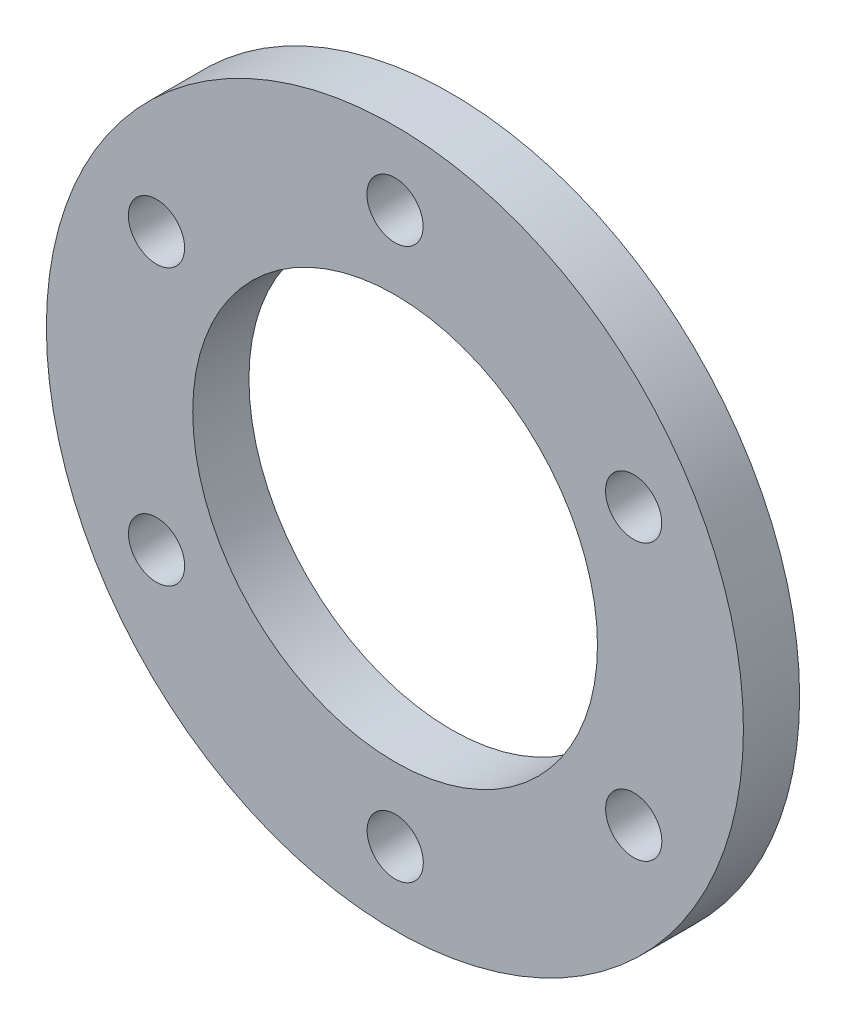
ISO-10303-21;
HEADER;
FILE_DESCRIPTION(('STEP AP214'),'2;1');
FILE_NAME('part.step','',(''),(''),'','','');
FILE_SCHEMA(('AUTOMOTIVE_DESIGN { 1 0 10303 214 1 1 1 1 }'));
ENDSEC;
DATA;
#1=APPLICATION_CONTEXT('core data for automotive mechanical design processes');
#2=APPLICATION_PROTOCOL_DEFINITION('international standard','automotive_design',2000,#1);
#3=PRODUCT_CONTEXT('',#1,'mechanical');
#4=PRODUCT('Part','Part','',(#3));
#5=PRODUCT_RELATED_PRODUCT_CATEGORY('part','',(#4));
#6=PRODUCT_DEFINITION_FORMATION('','',#4);
#7=PRODUCT_DEFINITION_CONTEXT('part definition',#1,'design');
#8=PRODUCT_DEFINITION('design','',#6,#7);
#9=PRODUCT_DEFINITION_SHAPE('','',#8);
#10=(LENGTH_UNIT() NAMED_UNIT(*) SI_UNIT(.MILLI.,.METRE.));
#11=(NAMED_UNIT(*) PLANE_ANGLE_UNIT() SI_UNIT($,.RADIAN.));
#12=(NAMED_UNIT(*) SI_UNIT($,.STERADIAN.) SOLID_ANGLE_UNIT());
#13=UNCERTAINTY_MEASURE_WITH_UNIT(LENGTH_MEASURE(1.E-05),#10,'distance_accuracy_value','');
#14=(GEOMETRIC_REPRESENTATION_CONTEXT(3) GLOBAL_UNCERTAINTY_ASSIGNED_CONTEXT((#13)) GLOBAL_UNIT_ASSIGNED_CONTEXT((#10,
#11,#12)) REPRESENTATION_CONTEXT('',''));
#15=CARTESIAN_POINT('',(0.,0.,0.));
#16=DIRECTION('',(0.,0.,1.));
#17=DIRECTION('',(1.,0.,0.));
#18=AXIS2_PLACEMENT_3D('',#15,#16,#17);
#19=CARTESIAN_POINT('',(-36.2937649360692,16.3690427494172,5.));
#20=DIRECTION('',(0.,0.,1.));
#21=DIRECTION('',(1.,0.,0.));
#22=AXIS2_PLACEMENT_3D('',#19,#20,#21);
#23=PLANE('',#22);
#24=CARTESIAN_POINT('',(-57.4912033167103,4.10356593282855,5.));
#25=DIRECTION('',(0.,0.,1.));
#26=DIRECTION('',(1.,0.,0.));
#27=AXIS2_PLACEMENT_3D('',#24,#25,#26);
#28=CIRCLE('',#27,2.50000000000001);
#29=CARTESIAN_POINT('',(-54.9912033167103,4.10356593282855,5.));
#30=VERTEX_POINT('',#29);
#31=EDGE_CURVE('E86',#30,#30,#28,.T.);
#32=ORIENTED_EDGE('',*,*,#31,.F.);
#33=EDGE_LOOP('',(#32));
#34=FACE_BOUND('',#33,.T.);
#35=CARTESIAN_POINT('',(-36.2663949304136,-8.14004818240942,5.));
#36=DIRECTION('',(0.,0.,1.));
#37=DIRECTION('',(1.,0.,0.));
#38=AXIS2_PLACEMENT_3D('',#35,#36,#37);
#39=CIRCLE('',#38,2.5);
#40=CARTESIAN_POINT('',(-33.7663949304136,-8.14004818240942,5.));
#41=VERTEX_POINT('',#40);
#42=EDGE_CURVE('E95',#41,#41,#39,.T.);
#43=ORIENTED_EDGE('',*,*,#42,.F.);
#44=EDGE_LOOP('',(#43));
#45=FACE_BOUND('',#44,.T.);
#46=CARTESIAN_POINT('',(-15.0507098793354,4.11936801296157,5.));
#47=DIRECTION('',(0.,0.,1.));
#48=DIRECTION('',(1.,0.,0.));
#49=AXIS2_PLACEMENT_3D('',#46,#47,#48);
#50=CIRCLE('',#49,2.5);
#51=CARTESIAN_POINT('',(-12.5507098793354,4.11936801296157,5.));
#52=VERTEX_POINT('',#51);
#53=EDGE_CURVE('E70',#52,#52,#50,.T.);
#54=ORIENTED_EDGE('',*,*,#53,.F.);
#55=EDGE_LOOP('',(#54));
#56=FACE_BOUND('',#55,.T.);
#57=CARTESIAN_POINT('',(-36.2846416008508,40.8660124388083,5.));
#58=DIRECTION('',(0.,0.,1.));
#59=DIRECTION('',(1.,0.,0.));
#60=AXIS2_PLACEMENT_3D('',#57,#58,#59);
#61=CIRCLE('',#60,2.5);
#62=CARTESIAN_POINT('',(-33.7846416008508,40.8660124388083,5.));
#63=VERTEX_POINT('',#62);
#64=EDGE_CURVE('E79',#63,#63,#61,.T.);
#65=ORIENTED_EDGE('',*,*,#64,.F.);
#66=EDGE_LOOP('',(#65));
#67=FACE_BOUND('',#66,.T.);
#68=CARTESIAN_POINT('',(-57.5003266519287,28.6065962434375,5.));
#69=DIRECTION('',(0.,0.,1.));
#70=DIRECTION('',(1.,0.,0.));
#71=AXIS2_PLACEMENT_3D('',#68,#69,#70);
#72=CIRCLE('',#71,2.5);
#73=CARTESIAN_POINT('',(-55.0003266519287,28.6065962434375,5.));
#74=VERTEX_POINT('',#73);
#75=EDGE_CURVE('E102',#74,#74,#72,.T.);
#76=ORIENTED_EDGE('',*,*,#75,.F.);
#77=EDGE_LOOP('',(#76));
#78=FACE_BOUND('',#77,.T.);
#79=CARTESIAN_POINT('',(-15.0598332145541,28.6223983235705,5.));
#80=DIRECTION('',(0.,0.,1.));
#81=DIRECTION('',(1.,0.,0.));
#82=AXIS2_PLACEMENT_3D('',#79,#80,#81);
#83=CIRCLE('',#82,2.5);
#84=CARTESIAN_POINT('',(-12.5598332145541,28.6223983235705,5.));
#85=VERTEX_POINT('',#84);
#86=EDGE_CURVE('E62',#85,#85,#83,.T.);
#87=ORIENTED_EDGE('',*,*,#86,.F.);
#88=EDGE_LOOP('',(#87));
#89=FACE_BOUND('',#88,.T.);
#90=CARTESIAN_POINT('',(-36.2937649360692,16.3690427494172,5.));
#91=DIRECTION('',(0.,0.,1.));
#92=DIRECTION('',(1.,0.,0.));
#93=AXIS2_PLACEMENT_3D('',#90,#91,#92);
#94=CIRCLE('',#93,31.);
#95=CARTESIAN_POINT('',(-5.29376493606924,16.3690427494172,5.));
#96=VERTEX_POINT('',#95);
#97=EDGE_CURVE('E10',#96,#96,#94,.T.);
#98=ORIENTED_EDGE('',*,*,#97,.T.);
#99=EDGE_LOOP('',(#98));
#100=FACE_BOUND('',#99,.T.);
#101=CARTESIAN_POINT('',(-36.2755182656325,16.3629821281995,5.));
#102=DIRECTION('',(0.,0.,1.));
#103=DIRECTION('',(1.,0.,0.));
#104=AXIS2_PLACEMENT_3D('',#101,#102,#103);
#105=CIRCLE('',#104,18.);
#106=CARTESIAN_POINT('',(-18.2755182656325,16.3629821281995,5.));
#107=VERTEX_POINT('',#106);
#108=EDGE_CURVE('E52',#107,#107,#105,.T.);
#109=ORIENTED_EDGE('',*,*,#108,.F.);
#110=EDGE_LOOP('',(#109));
#111=FACE_BOUND('',#110,.T.);
#112=ADVANCED_FACE('F39',(#34,#45,#56,#67,#78,#89,#100,#111),#23,.T.);
#113=CARTESIAN_POINT('',(-36.2937649360692,16.3690427494172,0.));
#114=DIRECTION('',(0.,0.,1.));
#115=DIRECTION('',(1.,0.,0.));
#116=AXIS2_PLACEMENT_3D('',#113,#114,#115);
#117=PLANE('',#116);
#118=CARTESIAN_POINT('',(-57.4912033167103,4.10356593282855,0.));
#119=DIRECTION('',(0.,0.,1.));
#120=DIRECTION('',(1.,0.,0.));
#121=AXIS2_PLACEMENT_3D('',#118,#119,#120);
#122=CIRCLE('',#121,2.50000000000001);
#123=CARTESIAN_POINT('',(-54.9912033167103,4.10356593282855,0.));
#124=VERTEX_POINT('',#123);
#125=EDGE_CURVE('E90',#124,#124,#122,.T.);
#126=ORIENTED_EDGE('',*,*,#125,.T.);
#127=EDGE_LOOP('',(#126));
#128=FACE_BOUND('',#127,.T.);
#129=CARTESIAN_POINT('',(-36.2663949304136,-8.14004818240942,0.));
#130=DIRECTION('',(0.,0.,1.));
#131=DIRECTION('',(1.,0.,0.));
#132=AXIS2_PLACEMENT_3D('',#129,#130,#131);
#133=CIRCLE('',#132,2.5);
#134=CARTESIAN_POINT('',(-33.7663949304136,-8.14004818240942,0.));
#135=VERTEX_POINT('',#134);
#136=EDGE_CURVE('E75',#135,#135,#133,.T.);
#137=ORIENTED_EDGE('',*,*,#136,.T.);
#138=EDGE_LOOP('',(#137));
#139=FACE_BOUND('',#138,.T.);
#140=CARTESIAN_POINT('',(-15.0507098793354,4.11936801296157,0.));
#141=DIRECTION('',(0.,0.,1.));
#142=DIRECTION('',(1.,0.,0.));
#143=AXIS2_PLACEMENT_3D('',#140,#141,#142);
#144=CIRCLE('',#143,2.5);
#145=CARTESIAN_POINT('',(-12.5507098793354,4.11936801296157,0.));
#146=VERTEX_POINT('',#145);
#147=EDGE_CURVE('E74',#146,#146,#144,.T.);
#148=ORIENTED_EDGE('',*,*,#147,.T.);
#149=EDGE_LOOP('',(#148));
#150=FACE_BOUND('',#149,.T.);
#151=CARTESIAN_POINT('',(-36.2846416008508,40.8660124388083,0.));
#152=DIRECTION('',(0.,0.,1.));
#153=DIRECTION('',(1.,0.,0.));
#154=AXIS2_PLACEMENT_3D('',#151,#152,#153);
#155=CIRCLE('',#154,2.5);
#156=CARTESIAN_POINT('',(-33.7846416008508,40.8660124388083,0.));
#157=VERTEX_POINT('',#156);
#158=EDGE_CURVE('E66',#157,#157,#155,.T.);
#159=ORIENTED_EDGE('',*,*,#158,.T.);
#160=EDGE_LOOP('',(#159));
#161=FACE_BOUND('',#160,.T.);
#162=CARTESIAN_POINT('',(-57.5003266519287,28.6065962434375,0.));
#163=DIRECTION('',(0.,0.,1.));
#164=DIRECTION('',(1.,0.,0.));
#165=AXIS2_PLACEMENT_3D('',#162,#163,#164);
#166=CIRCLE('',#165,2.5);
#167=CARTESIAN_POINT('',(-55.0003266519287,28.6065962434375,0.));
#168=VERTEX_POINT('',#167);
#169=EDGE_CURVE('E91',#168,#168,#166,.T.);
#170=ORIENTED_EDGE('',*,*,#169,.T.);
#171=EDGE_LOOP('',(#170));
#172=FACE_BOUND('',#171,.T.);
#173=CARTESIAN_POINT('',(-15.0598332145541,28.6223983235705,0.));
#174=DIRECTION('',(0.,0.,1.));
#175=DIRECTION('',(1.,0.,0.));
#176=AXIS2_PLACEMENT_3D('',#173,#174,#175);
#177=CIRCLE('',#176,2.5);
#178=CARTESIAN_POINT('',(-12.5598332145541,28.6223983235705,0.));
#179=VERTEX_POINT('',#178);
#180=EDGE_CURVE('E58',#179,#179,#177,.T.);
#181=ORIENTED_EDGE('',*,*,#180,.T.);
#182=EDGE_LOOP('',(#181));
#183=FACE_BOUND('',#182,.T.);
#184=CARTESIAN_POINT('',(-36.2937649360692,16.3690427494172,0.));
#185=DIRECTION('',(0.,0.,1.));
#186=DIRECTION('',(1.,0.,0.));
#187=AXIS2_PLACEMENT_3D('',#184,#185,#186);
#188=CIRCLE('',#187,31.);
#189=CARTESIAN_POINT('',(-5.29376493606924,16.3690427494172,0.));
#190=VERTEX_POINT('',#189);
#191=EDGE_CURVE('E43',#190,#190,#188,.T.);
#192=ORIENTED_EDGE('',*,*,#191,.F.);
#193=EDGE_LOOP('',(#192));
#194=FACE_BOUND('',#193,.T.);
#195=CARTESIAN_POINT('',(-36.2755182656325,16.3629821281995,0.));
#196=DIRECTION('',(0.,0.,1.));
#197=DIRECTION('',(1.,0.,0.));
#198=AXIS2_PLACEMENT_3D('',#195,#196,#197);
#199=CIRCLE('',#198,18.);
#200=CARTESIAN_POINT('',(-18.2755182656325,16.3629821281995,0.));
#201=VERTEX_POINT('',#200);
#202=EDGE_CURVE('E54',#201,#201,#199,.T.);
#203=ORIENTED_EDGE('',*,*,#202,.T.);
#204=EDGE_LOOP('',(#203));
#205=FACE_BOUND('',#204,.T.);
#206=ADVANCED_FACE('F110',(#128,#139,#150,#161,#172,#183,#194,#205),#117,.F.);
#207=CARTESIAN_POINT('',(-36.2937649360692,16.3690427494172,5.));
#208=DIRECTION('',(0.,0.,-1.));
#209=DIRECTION('',(-1.,0.,0.));
#210=AXIS2_PLACEMENT_3D('',#207,#208,#209);
#211=CYLINDRICAL_SURFACE('',#210,31.);
#212=ORIENTED_EDGE('',*,*,#97,.F.);
#213=EDGE_LOOP('',(#212));
#214=FACE_BOUND('',#213,.T.);
#215=ORIENTED_EDGE('',*,*,#191,.T.);
#216=EDGE_LOOP('',(#215));
#217=FACE_BOUND('',#216,.T.);
#218=ADVANCED_FACE('F41',(#214,#217),#211,.T.);
#219=CARTESIAN_POINT('',(-36.2755182656325,16.3629821281995,5.));
#220=DIRECTION('',(0.,0.,-1.));
#221=DIRECTION('',(-1.,0.,0.));
#222=AXIS2_PLACEMENT_3D('',#219,#220,#221);
#223=CYLINDRICAL_SURFACE('',#222,18.);
#224=ORIENTED_EDGE('',*,*,#108,.T.);
#225=EDGE_LOOP('',(#224));
#226=FACE_BOUND('',#225,.T.);
#227=ORIENTED_EDGE('',*,*,#202,.F.);
#228=EDGE_LOOP('',(#227));
#229=FACE_BOUND('',#228,.T.);
#230=ADVANCED_FACE('F129',(#226,#229),#223,.F.);
#231=CARTESIAN_POINT('',(-15.0598332145541,28.6223983235705,0.));
#232=DIRECTION('',(0.,0.,1.));
#233=DIRECTION('',(1.,0.,0.));
#234=AXIS2_PLACEMENT_3D('',#231,#232,#233);
#235=CYLINDRICAL_SURFACE('',#234,2.5);
#236=ORIENTED_EDGE('',*,*,#180,.F.);
#237=EDGE_LOOP('',(#236));
#238=FACE_BOUND('',#237,.T.);
#239=ORIENTED_EDGE('',*,*,#86,.T.);
#240=EDGE_LOOP('',(#239));
#241=FACE_BOUND('',#240,.T.);
#242=ADVANCED_FACE('F117',(#238,#241),#235,.F.);
#243=CARTESIAN_POINT('',(-57.5003266519287,28.6065962434375,0.));
#244=DIRECTION('',(0.,0.,1.));
#245=DIRECTION('',(1.,0.,0.));
#246=AXIS2_PLACEMENT_3D('',#243,#244,#245);
#247=CYLINDRICAL_SURFACE('',#246,2.5);
#248=ORIENTED_EDGE('',*,*,#169,.F.);
#249=EDGE_LOOP('',(#248));
#250=FACE_BOUND('',#249,.T.);
#251=ORIENTED_EDGE('',*,*,#75,.T.);
#252=EDGE_LOOP('',(#251));
#253=FACE_BOUND('',#252,.T.);
#254=ADVANCED_FACE('F113',(#250,#253),#247,.F.);
#255=CARTESIAN_POINT('',(-36.2846416008508,40.8660124388083,0.));
#256=DIRECTION('',(0.,0.,1.));
#257=DIRECTION('',(1.,0.,0.));
#258=AXIS2_PLACEMENT_3D('',#255,#256,#257);
#259=CYLINDRICAL_SURFACE('',#258,2.5);
#260=ORIENTED_EDGE('',*,*,#158,.F.);
#261=EDGE_LOOP('',(#260));
#262=FACE_BOUND('',#261,.T.);
#263=ORIENTED_EDGE('',*,*,#64,.T.);
#264=EDGE_LOOP('',(#263));
#265=FACE_BOUND('',#264,.T.);
#266=ADVANCED_FACE('F116',(#262,#265),#259,.F.);
#267=CARTESIAN_POINT('',(-15.0507098793354,4.11936801296157,0.));
#268=DIRECTION('',(0.,0.,1.));
#269=DIRECTION('',(1.,0.,0.));
#270=AXIS2_PLACEMENT_3D('',#267,#268,#269);
#271=CYLINDRICAL_SURFACE('',#270,2.5);
#272=ORIENTED_EDGE('',*,*,#147,.F.);
#273=EDGE_LOOP('',(#272));
#274=FACE_BOUND('',#273,.T.);
#275=ORIENTED_EDGE('',*,*,#53,.T.);
#276=EDGE_LOOP('',(#275));
#277=FACE_BOUND('',#276,.T.);
#278=ADVANCED_FACE('F146',(#274,#277),#271,.F.);
#279=CARTESIAN_POINT('',(-36.2663949304136,-8.14004818240942,0.));
#280=DIRECTION('',(0.,0.,1.));
#281=DIRECTION('',(1.,0.,0.));
#282=AXIS2_PLACEMENT_3D('',#279,#280,#281);
#283=CYLINDRICAL_SURFACE('',#282,2.5);
#284=ORIENTED_EDGE('',*,*,#136,.F.);
#285=EDGE_LOOP('',(#284));
#286=FACE_BOUND('',#285,.T.);
#287=ORIENTED_EDGE('',*,*,#42,.T.);
#288=EDGE_LOOP('',(#287));
#289=FACE_BOUND('',#288,.T.);
#290=ADVANCED_FACE('F149',(#286,#289),#283,.F.);
#291=CARTESIAN_POINT('',(-57.4912033167103,4.10356593282855,0.));
#292=DIRECTION('',(0.,0.,1.));
#293=DIRECTION('',(1.,0.,0.));
#294=AXIS2_PLACEMENT_3D('',#291,#292,#293);
#295=CYLINDRICAL_SURFACE('',#294,2.50000000000001);
#296=ORIENTED_EDGE('',*,*,#125,.F.);
#297=EDGE_LOOP('',(#296));
#298=FACE_BOUND('',#297,.T.);
#299=ORIENTED_EDGE('',*,*,#31,.T.);
#300=EDGE_LOOP('',(#299));
#301=FACE_BOUND('',#300,.T.);
#302=ADVANCED_FACE('F154',(#298,#301),#295,.F.);
#303=CLOSED_SHELL('',(#112,#206,#218,#230,#242,#254,#266,#278,#290,#302));
#304=MANIFOLD_SOLID_BREP('B2',#303);
#305=ADVANCED_BREP_SHAPE_REPRESENTATION('',(#18,#304),#14);
#306=SHAPE_DEFINITION_REPRESENTATION(#9,#305);
ENDSEC;
END-ISO-10303-21;
